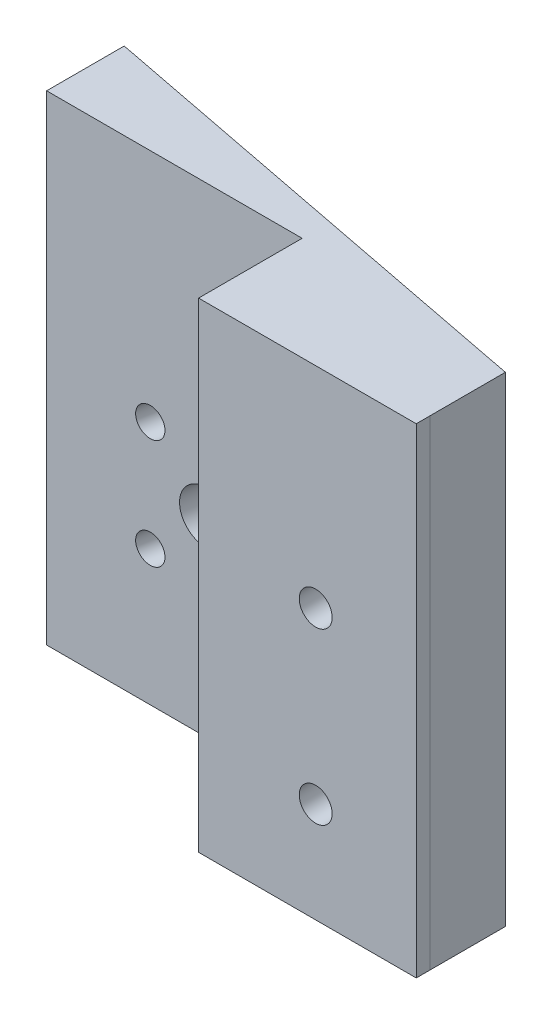
ISO-10303-21;
HEADER;
FILE_DESCRIPTION(('STEP AP214'),'2;1');
FILE_NAME('part.step','',(''),(''),'','','');
FILE_SCHEMA(('AUTOMOTIVE_DESIGN { 1 0 10303 214 1 1 1 1 }'));
ENDSEC;
DATA;
#1=APPLICATION_CONTEXT('core data for automotive mechanical design processes');
#2=APPLICATION_PROTOCOL_DEFINITION('international standard','automotive_design',2000,#1);
#3=PRODUCT_CONTEXT('',#1,'mechanical');
#4=PRODUCT('Part','Part','',(#3));
#5=PRODUCT_RELATED_PRODUCT_CATEGORY('part','',(#4));
#6=PRODUCT_DEFINITION_FORMATION('','',#4);
#7=PRODUCT_DEFINITION_CONTEXT('part definition',#1,'design');
#8=PRODUCT_DEFINITION('design','',#6,#7);
#9=PRODUCT_DEFINITION_SHAPE('','',#8);
#10=(LENGTH_UNIT() NAMED_UNIT(*) SI_UNIT(.MILLI.,.METRE.));
#11=(NAMED_UNIT(*) PLANE_ANGLE_UNIT() SI_UNIT($,.RADIAN.));
#12=(NAMED_UNIT(*) SI_UNIT($,.STERADIAN.) SOLID_ANGLE_UNIT());
#13=UNCERTAINTY_MEASURE_WITH_UNIT(LENGTH_MEASURE(1.E-05),#10,'distance_accuracy_value','');
#14=(GEOMETRIC_REPRESENTATION_CONTEXT(3) GLOBAL_UNCERTAINTY_ASSIGNED_CONTEXT((#13)) GLOBAL_UNIT_ASSIGNED_CONTEXT((#10,
#11,#12)) REPRESENTATION_CONTEXT('',''));
#15=CARTESIAN_POINT('',(0.,0.,0.));
#16=DIRECTION('',(0.,0.,1.));
#17=DIRECTION('',(1.,0.,0.));
#18=AXIS2_PLACEMENT_3D('',#15,#16,#17);
#19=CARTESIAN_POINT('',(3.44867350098541,70.,-17.7418871092655));
#20=DIRECTION('',(-0.190808995376538,0.,0.981627183447665));
#21=DIRECTION('',(0.981627183447665,0.,0.190808995376538));
#22=AXIS2_PLACEMENT_3D('',#19,#20,#21);
#23=PLANE('',#22);
#24=CARTESIAN_POINT('',(54.3368727091732,12.6086638620849,-7.85022321571653));
#25=DIRECTION('',(-0.190808995376538,0.,0.981627183447665));
#26=DIRECTION('',(0.981627183447665,0.,0.190808995376538));
#27=AXIS2_PLACEMENT_3D('',#24,#25,#26);
#28=ELLIPSE('',#27,2.44492006789251,2.4);
#29=CARTESIAN_POINT('',(56.7368727091732,12.6086638620849,-7.38371047378602));
#30=VERTEX_POINT('',#29);
#31=EDGE_CURVE('E416',#30,#30,#28,.T.);
#32=ORIENTED_EDGE('',*,*,#31,.T.);
#33=EDGE_LOOP('',(#32));
#34=FACE_BOUND('',#33,.T.);
#35=CARTESIAN_POINT('',(54.3368727091734,37.3862667273349,-7.8502232157165));
#36=DIRECTION('',(-0.190808995376538,0.,0.981627183447665));
#37=DIRECTION('',(0.981627183447665,0.,0.190808995376538));
#38=AXIS2_PLACEMENT_3D('',#35,#36,#37);
#39=ELLIPSE('',#38,2.44492006789251,2.4);
#40=CARTESIAN_POINT('',(56.7368727091734,37.3862667273349,-7.383710473786));
#41=VERTEX_POINT('',#40);
#42=EDGE_CURVE('E418',#41,#41,#39,.T.);
#43=ORIENTED_EDGE('',*,*,#42,.T.);
#44=EDGE_LOOP('',(#43));
#45=FACE_BOUND('',#44,.T.);
#46=CARTESIAN_POINT('',(16.6876621186104,33.72195575,-15.1684884091009));
#47=DIRECTION('',(0.190808995376538,0.,-0.981627183447665));
#48=DIRECTION('',(-0.981627183447665,0.,-0.190808995376538));
#49=AXIS2_PLACEMENT_3D('',#46,#47,#48);
#50=CIRCLE('',#49,2.1);
#51=CARTESIAN_POINT('',(14.6262450333704,33.72195575,-15.5691872993917));
#52=VERTEX_POINT('',#51);
#53=EDGE_CURVE('E417',#52,#52,#50,.T.);
#54=ORIENTED_EDGE('',*,*,#53,.F.);
#55=EDGE_LOOP('',(#54));
#56=FACE_BOUND('',#55,.T.);
#57=CARTESIAN_POINT('',(16.6876621186104,17.72195575,-15.1684884091009));
#58=DIRECTION('',(0.190808995376538,0.,-0.981627183447665));
#59=DIRECTION('',(-0.981627183447665,0.,-0.190808995376538));
#60=AXIS2_PLACEMENT_3D('',#57,#58,#59);
#61=CIRCLE('',#60,2.1);
#62=CARTESIAN_POINT('',(14.6262450333703,17.72195575,-15.5691872993917));
#63=VERTEX_POINT('',#62);
#64=EDGE_CURVE('E421',#63,#63,#61,.T.);
#65=ORIENTED_EDGE('',*,*,#64,.F.);
#66=EDGE_LOOP('',(#65));
#67=FACE_BOUND('',#66,.T.);
#68=CARTESIAN_POINT('',(32.3936970537731,17.72195575,-12.1155444830763));
#69=DIRECTION('',(0.190808995376538,0.,-0.981627183447665));
#70=DIRECTION('',(-0.981627183447665,0.,-0.190808995376538));
#71=AXIS2_PLACEMENT_3D('',#68,#69,#70);
#72=CIRCLE('',#71,2.1);
#73=CARTESIAN_POINT('',(30.332279968533,17.72195575,-12.516243373367));
#74=VERTEX_POINT('',#73);
#75=EDGE_CURVE('E427',#74,#74,#72,.T.);
#76=ORIENTED_EDGE('',*,*,#75,.F.);
#77=EDGE_LOOP('',(#76));
#78=FACE_BOUND('',#77,.T.);
#79=CARTESIAN_POINT('',(32.3936970537731,33.72195575,-12.1155444830763));
#80=DIRECTION('',(0.190808995376538,0.,-0.981627183447665));
#81=DIRECTION('',(-0.981627183447665,0.,-0.190808995376538));
#82=AXIS2_PLACEMENT_3D('',#79,#80,#81);
#83=CIRCLE('',#82,2.1);
#84=CARTESIAN_POINT('',(30.332279968533,33.72195575,-12.516243373367));
#85=VERTEX_POINT('',#84);
#86=EDGE_CURVE('E211',#85,#85,#83,.T.);
#87=ORIENTED_EDGE('',*,*,#86,.F.);
#88=EDGE_LOOP('',(#87));
#89=FACE_BOUND('',#88,.T.);
#90=CARTESIAN_POINT('',(24.5406795861918,25.72195575,-13.6420164460886));
#91=DIRECTION('',(0.190808995376538,0.,-0.981627183447665));
#92=DIRECTION('',(-0.981627183447665,0.,-0.190808995376538));
#93=AXIS2_PLACEMENT_3D('',#90,#91,#92);
#94=CIRCLE('',#93,3.81000000000006);
#95=CARTESIAN_POINT('',(20.8006800172561,25.72195575,-14.3689987184732));
#96=VERTEX_POINT('',#95);
#97=EDGE_CURVE('E139',#96,#96,#94,.T.);
#98=ORIENTED_EDGE('',*,*,#97,.F.);
#99=EDGE_LOOP('',(#98));
#100=FACE_BOUND('',#99,.T.);
#101=DIRECTION('',(-0.981627183447665,0.,-0.190808995376538));
#102=VECTOR('',#101,1.);
#103=CARTESIAN_POINT('',(3.44867350098541,68.,-17.7418871092655));
#104=LINE('',#103,#102);
#105=CARTESIAN_POINT('',(69.,68.,-5.));
#106=VERTEX_POINT('',#105);
#107=CARTESIAN_POINT('',(0.,68.,-18.4122413305021));
#108=VERTEX_POINT('',#107);
#109=EDGE_CURVE('E228',#106,#108,#104,.T.);
#110=ORIENTED_EDGE('',*,*,#109,.F.);
#111=DIRECTION('',(0.,-1.,0.));
#112=VECTOR('',#111,1.);
#113=CARTESIAN_POINT('',(69.,70.,-5.));
#114=LINE('',#113,#112);
#115=CARTESIAN_POINT('',(69.,-2.,-5.));
#116=VERTEX_POINT('',#115);
#117=EDGE_CURVE('E55',#106,#116,#114,.T.);
#118=ORIENTED_EDGE('',*,*,#117,.T.);
#119=DIRECTION('',(0.981627183447665,0.,0.190808995376538));
#120=VECTOR('',#119,1.);
#121=CARTESIAN_POINT('',(69.,-2.,-5.));
#122=LINE('',#121,#120);
#123=CARTESIAN_POINT('',(0.,-2.,-18.4122413305021));
#124=VERTEX_POINT('',#123);
#125=EDGE_CURVE('E195',#124,#116,#122,.T.);
#126=ORIENTED_EDGE('',*,*,#125,.F.);
#127=DIRECTION('',(0.,-1.,0.));
#128=VECTOR('',#127,1.);
#129=CARTESIAN_POINT('',(0.,70.,-18.4122413305021));
#130=LINE('',#129,#128);
#131=EDGE_CURVE('E13',#108,#124,#130,.T.);
#132=ORIENTED_EDGE('',*,*,#131,.F.);
#133=EDGE_LOOP('',(#110,#118,#126,#132));
#134=FACE_BOUND('',#133,.T.);
#135=ADVANCED_FACE('F47',(#34,#45,#56,#67,#78,#89,#100,#134),#23,.F.);
#136=CARTESIAN_POINT('',(0.,70.,0.));
#137=DIRECTION('',(1.,0.,0.));
#138=DIRECTION('',(0.,0.,-1.));
#139=AXIS2_PLACEMENT_3D('',#136,#137,#138);
#140=PLANE('',#139);
#141=DIRECTION('',(0.,0.,1.));
#142=VECTOR('',#141,1.);
#143=CARTESIAN_POINT('',(0.,68.,0.));
#144=LINE('',#143,#142);
#145=CARTESIAN_POINT('',(0.,68.,-7.1));
#146=VERTEX_POINT('',#145);
#147=EDGE_CURVE('E201',#108,#146,#144,.T.);
#148=ORIENTED_EDGE('',*,*,#147,.F.);
#149=ORIENTED_EDGE('',*,*,#131,.T.);
#150=DIRECTION('',(0.,0.,-1.));
#151=VECTOR('',#150,1.);
#152=CARTESIAN_POINT('',(0.,-2.,-18.4122413305021));
#153=LINE('',#152,#151);
#154=CARTESIAN_POINT('',(0.,-2.00000000000002,-7.1));
#155=VERTEX_POINT('',#154);
#156=EDGE_CURVE('E117',#155,#124,#153,.T.);
#157=ORIENTED_EDGE('',*,*,#156,.F.);
#158=DIRECTION('',(0.,1.,0.));
#159=VECTOR('',#158,1.);
#160=CARTESIAN_POINT('',(0.,-2.00000000000002,-7.1));
#161=LINE('',#160,#159);
#162=EDGE_CURVE('E240',#155,#146,#161,.T.);
#163=ORIENTED_EDGE('',*,*,#162,.T.);
#164=EDGE_LOOP('',(#148,#149,#157,#163));
#165=FACE_BOUND('',#164,.T.);
#166=ADVANCED_FACE('F182',(#165),#140,.F.);
#167=CARTESIAN_POINT('',(69.,70.,0.));
#168=DIRECTION('',(1.,0.,0.));
#169=DIRECTION('',(0.,0.,-1.));
#170=AXIS2_PLACEMENT_3D('',#167,#168,#169);
#171=PLANE('',#170);
#172=ORIENTED_EDGE('',*,*,#117,.F.);
#173=DIRECTION('',(0.,0.,1.));
#174=VECTOR('',#173,1.);
#175=CARTESIAN_POINT('',(69.,68.,0.));
#176=LINE('',#175,#174);
#177=CARTESIAN_POINT('',(69.0029404501429,68.,6.));
#178=VERTEX_POINT('',#177);
#179=EDGE_CURVE('E198',#106,#178,#176,.T.);
#180=ORIENTED_EDGE('',*,*,#179,.T.);
#181=CARTESIAN_POINT('',(69.0058809002858,-2.00000000000002,6.));
#182=DIRECTION('',(0.,1.,0.));
#183=VECTOR('',#182,1.);
#184=LINE('',#181,#183);
#185=CARTESIAN_POINT('',(69.0029404501429,-2.00000000000001,6.));
#186=VERTEX_POINT('',#185);
#187=EDGE_CURVE('E148',#186,#178,#184,.T.);
#188=ORIENTED_EDGE('',*,*,#187,.F.);
#189=DIRECTION('',(0.,0.,1.));
#190=VECTOR('',#189,1.);
#191=CARTESIAN_POINT('',(69.,-2.,6.));
#192=LINE('',#191,#190);
#193=EDGE_CURVE('E118',#116,#186,#192,.T.);
#194=ORIENTED_EDGE('',*,*,#193,.F.);
#195=EDGE_LOOP('',(#172,#180,#188,#194));
#196=FACE_BOUND('',#195,.T.);
#197=ADVANCED_FACE('F179',(#196),#171,.T.);
#198=CARTESIAN_POINT('',(37.2613586201258,0.,-9.1));
#199=DIRECTION('',(1.,0.,0.));
#200=DIRECTION('',(0.,0.,-1.));
#201=AXIS2_PLACEMENT_3D('',#198,#199,#200);
#202=PLANE('',#201);
#203=DIRECTION('',(0.,0.,1.));
#204=VECTOR('',#203,1.);
#205=CARTESIAN_POINT('',(37.2613586201258,68.,-9.1));
#206=LINE('',#205,#204);
#207=CARTESIAN_POINT('',(37.2613586201258,68.,-7.1));
#208=VERTEX_POINT('',#207);
#209=CARTESIAN_POINT('',(37.2613586201258,68.,8.));
#210=VERTEX_POINT('',#209);
#211=EDGE_CURVE('E202',#208,#210,#206,.T.);
#212=ORIENTED_EDGE('',*,*,#211,.F.);
#213=DIRECTION('',(0.,1.,0.));
#214=VECTOR('',#213,1.);
#215=CARTESIAN_POINT('',(37.2613586201258,-2.00000000000002,-7.1));
#216=LINE('',#215,#214);
#217=CARTESIAN_POINT('',(37.2613586201258,-2.00000000000002,-7.1));
#218=VERTEX_POINT('',#217);
#219=EDGE_CURVE('E113',#218,#208,#216,.T.);
#220=ORIENTED_EDGE('',*,*,#219,.F.);
#221=DIRECTION('',(0.,0.,-1.));
#222=VECTOR('',#221,1.);
#223=CARTESIAN_POINT('',(37.2613586201258,-2.,-9.1));
#224=LINE('',#223,#222);
#225=CARTESIAN_POINT('',(37.2613586201258,-2.00000000000002,8.));
#226=VERTEX_POINT('',#225);
#227=EDGE_CURVE('E107',#226,#218,#224,.T.);
#228=ORIENTED_EDGE('',*,*,#227,.F.);
#229=DIRECTION('',(0.,1.,0.));
#230=VECTOR('',#229,1.);
#231=CARTESIAN_POINT('',(37.2613586201258,-2.00000000000002,8.));
#232=LINE('',#231,#230);
#233=EDGE_CURVE('E111',#226,#210,#232,.T.);
#234=ORIENTED_EDGE('',*,*,#233,.T.);
#235=EDGE_LOOP('',(#212,#220,#228,#234));
#236=FACE_BOUND('',#235,.T.);
#237=ADVANCED_FACE('F110',(#236),#202,.F.);
#238=CARTESIAN_POINT('',(0.,-2.,0.));
#239=DIRECTION('',(0.,1.,0.));
#240=DIRECTION('',(0.,0.,1.));
#241=AXIS2_PLACEMENT_3D('',#238,#239,#240);
#242=PLANE('',#241);
#243=DIRECTION('',(1.,0.,0.));
#244=VECTOR('',#243,1.);
#245=CARTESIAN_POINT('',(0.,-2.00000000000002,-7.1));
#246=LINE('',#245,#244);
#247=EDGE_CURVE('E243',#155,#218,#246,.T.);
#248=ORIENTED_EDGE('',*,*,#247,.F.);
#249=ORIENTED_EDGE('',*,*,#156,.T.);
#250=ORIENTED_EDGE('',*,*,#125,.T.);
#251=ORIENTED_EDGE('',*,*,#193,.T.);
#252=DIRECTION('',(0.,0.,-1.));
#253=VECTOR('',#252,1.);
#254=CARTESIAN_POINT('',(69.0058809002858,-2.00000000000002,6.));
#255=LINE('',#254,#253);
#256=CARTESIAN_POINT('',(69.0058809002858,-2.00000000000002,8.));
#257=VERTEX_POINT('',#256);
#258=EDGE_CURVE('E127',#257,#186,#255,.T.);
#259=ORIENTED_EDGE('',*,*,#258,.F.);
#260=DIRECTION('',(1.,0.,0.));
#261=VECTOR('',#260,1.);
#262=CARTESIAN_POINT('',(37.2613586201258,-2.00000000000002,8.));
#263=LINE('',#262,#261);
#264=EDGE_CURVE('E123',#226,#257,#263,.T.);
#265=ORIENTED_EDGE('',*,*,#264,.F.);
#266=ORIENTED_EDGE('',*,*,#227,.T.);
#267=EDGE_LOOP('',(#248,#249,#250,#251,#259,#265,#266));
#268=FACE_BOUND('',#267,.T.);
#269=ADVANCED_FACE('F130',(#268),#242,.F.);
#270=CARTESIAN_POINT('',(28.7980207423715,68.,-8.89852110577039));
#271=DIRECTION('',(0.,1.,0.));
#272=DIRECTION('',(0.,0.,1.));
#273=AXIS2_PLACEMENT_3D('',#270,#271,#272);
#274=PLANE('',#273);
#275=ORIENTED_EDGE('',*,*,#109,.T.);
#276=ORIENTED_EDGE('',*,*,#147,.T.);
#277=DIRECTION('',(1.,0.,0.));
#278=VECTOR('',#277,1.);
#279=CARTESIAN_POINT('',(0.,68.,-7.1));
#280=LINE('',#279,#278);
#281=EDGE_CURVE('E63',#146,#208,#280,.T.);
#282=ORIENTED_EDGE('',*,*,#281,.T.);
#283=ORIENTED_EDGE('',*,*,#211,.T.);
#284=DIRECTION('',(1.,0.,0.));
#285=VECTOR('',#284,1.);
#286=CARTESIAN_POINT('',(37.2613586201258,68.,8.));
#287=LINE('',#286,#285);
#288=CARTESIAN_POINT('',(69.0058809002858,68.,8.));
#289=VERTEX_POINT('',#288);
#290=EDGE_CURVE('E125',#210,#289,#287,.T.);
#291=ORIENTED_EDGE('',*,*,#290,.T.);
#292=DIRECTION('',(0.,0.,-1.));
#293=VECTOR('',#292,1.);
#294=CARTESIAN_POINT('',(69.0058809002858,68.,6.));
#295=LINE('',#294,#293);
#296=EDGE_CURVE('E132',#289,#178,#295,.T.);
#297=ORIENTED_EDGE('',*,*,#296,.T.);
#298=ORIENTED_EDGE('',*,*,#179,.F.);
#299=EDGE_LOOP('',(#275,#276,#282,#283,#291,#297,#298));
#300=FACE_BOUND('',#299,.T.);
#301=ADVANCED_FACE('F171',(#300),#274,.T.);
#302=CARTESIAN_POINT('',(0.,-2.00000000000002,-7.1));
#303=DIRECTION('',(0.,0.,1.));
#304=DIRECTION('',(1.,0.,0.));
#305=AXIS2_PLACEMENT_3D('',#302,#303,#304);
#306=PLANE('',#305);
#307=CARTESIAN_POINT('',(15.1193068473754,33.72195575,-7.1));
#308=DIRECTION('',(0.,0.,1.));
#309=DIRECTION('',(1.,0.,0.));
#310=AXIS2_PLACEMENT_3D('',#307,#308,#309);
#311=ELLIPSE('',#310,2.13930505940594,2.1);
#312=CARTESIAN_POINT('',(17.2586119067813,33.72195575,-7.1));
#313=VERTEX_POINT('',#312);
#314=EDGE_CURVE('E50',#313,#313,#311,.T.);
#315=ORIENTED_EDGE('',*,*,#314,.F.);
#316=EDGE_LOOP('',(#315));
#317=FACE_BOUND('',#316,.T.);
#318=CARTESIAN_POINT('',(15.1193068473754,17.72195575,-7.1));
#319=DIRECTION('',(0.,0.,1.));
#320=DIRECTION('',(1.,0.,0.));
#321=AXIS2_PLACEMENT_3D('',#318,#319,#320);
#322=ELLIPSE('',#321,2.13930505940595,2.1);
#323=CARTESIAN_POINT('',(17.2586119067813,17.72195575,-7.1));
#324=VERTEX_POINT('',#323);
#325=EDGE_CURVE('E213',#324,#324,#322,.T.);
#326=ORIENTED_EDGE('',*,*,#325,.F.);
#327=EDGE_LOOP('',(#326));
#328=FACE_BOUND('',#327,.T.);
#329=CARTESIAN_POINT('',(31.4187739666588,17.72195575,-7.1));
#330=DIRECTION('',(0.,0.,1.));
#331=DIRECTION('',(1.,0.,0.));
#332=AXIS2_PLACEMENT_3D('',#329,#330,#331);
#333=ELLIPSE('',#332,2.13930505940595,2.1);
#334=CARTESIAN_POINT('',(33.5580790260647,17.72195575,-7.1));
#335=VERTEX_POINT('',#334);
#336=EDGE_CURVE('E210',#335,#335,#333,.T.);
#337=ORIENTED_EDGE('',*,*,#336,.F.);
#338=EDGE_LOOP('',(#337));
#339=FACE_BOUND('',#338,.T.);
#340=CARTESIAN_POINT('',(31.4187739666588,33.72195575,-7.1));
#341=DIRECTION('',(0.,0.,1.));
#342=DIRECTION('',(1.,0.,0.));
#343=AXIS2_PLACEMENT_3D('',#340,#341,#342);
#344=ELLIPSE('',#343,2.13930505940594,2.1);
#345=CARTESIAN_POINT('',(33.5580790260647,33.72195575,-7.1));
#346=VERTEX_POINT('',#345);
#347=EDGE_CURVE('E207',#346,#346,#344,.T.);
#348=ORIENTED_EDGE('',*,*,#347,.F.);
#349=EDGE_LOOP('',(#348));
#350=FACE_BOUND('',#349,.T.);
#351=CARTESIAN_POINT('',(23.2690404070171,25.72195575,-7.1));
#352=DIRECTION('',(0.,0.,1.));
#353=DIRECTION('',(1.,0.,0.));
#354=AXIS2_PLACEMENT_3D('',#351,#352,#353);
#355=ELLIPSE('',#354,3.88131060777943,3.81000000000006);
#356=CARTESIAN_POINT('',(27.1503510147965,25.72195575,-7.1));
#357=VERTEX_POINT('',#356);
#358=EDGE_CURVE('E142',#357,#357,#355,.T.);
#359=ORIENTED_EDGE('',*,*,#358,.F.);
#360=EDGE_LOOP('',(#359));
#361=FACE_BOUND('',#360,.T.);
#362=ORIENTED_EDGE('',*,*,#281,.F.);
#363=ORIENTED_EDGE('',*,*,#162,.F.);
#364=ORIENTED_EDGE('',*,*,#247,.T.);
#365=ORIENTED_EDGE('',*,*,#219,.T.);
#366=EDGE_LOOP('',(#362,#363,#364,#365));
#367=FACE_BOUND('',#366,.T.);
#368=ADVANCED_FACE('F163',(#317,#328,#339,#350,#361,#367),#306,.T.);
#369=CARTESIAN_POINT('',(69.0058809002858,-2.00000000000002,6.));
#370=DIRECTION('',(1.,0.,0.));
#371=DIRECTION('',(0.,0.,-1.));
#372=AXIS2_PLACEMENT_3D('',#369,#370,#371);
#373=PLANE('',#372);
#374=ORIENTED_EDGE('',*,*,#296,.F.);
#375=DIRECTION('',(0.,1.,0.));
#376=VECTOR('',#375,1.);
#377=CARTESIAN_POINT('',(69.0058809002858,-2.00000000000002,8.));
#378=LINE('',#377,#376);
#379=EDGE_CURVE('E126',#257,#289,#378,.T.);
#380=ORIENTED_EDGE('',*,*,#379,.F.);
#381=ORIENTED_EDGE('',*,*,#258,.T.);
#382=ORIENTED_EDGE('',*,*,#187,.T.);
#383=EDGE_LOOP('',(#374,#380,#381,#382));
#384=FACE_BOUND('',#383,.T.);
#385=ADVANCED_FACE('F153',(#384),#373,.T.);
#386=CARTESIAN_POINT('',(37.2613586201258,-2.00000000000002,8.));
#387=DIRECTION('',(0.,0.,1.));
#388=DIRECTION('',(1.,0.,0.));
#389=AXIS2_PLACEMENT_3D('',#386,#387,#388);
#390=PLANE('',#389);
#391=CARTESIAN_POINT('',(54.3368727091732,12.6086638620849,8.));
#392=DIRECTION('',(0.,0.,1.));
#393=DIRECTION('',(1.,0.,0.));
#394=AXIS2_PLACEMENT_3D('',#391,#392,#393);
#395=CIRCLE('',#394,2.4);
#396=CARTESIAN_POINT('',(56.7368727091732,12.6086638620849,8.));
#397=VERTEX_POINT('',#396);
#398=EDGE_CURVE('E413',#397,#397,#395,.T.);
#399=ORIENTED_EDGE('',*,*,#398,.F.);
#400=EDGE_LOOP('',(#399));
#401=FACE_BOUND('',#400,.T.);
#402=CARTESIAN_POINT('',(54.3368727091734,37.3862667273349,8.));
#403=DIRECTION('',(0.,0.,1.));
#404=DIRECTION('',(1.,0.,0.));
#405=AXIS2_PLACEMENT_3D('',#402,#403,#404);
#406=CIRCLE('',#405,2.4);
#407=CARTESIAN_POINT('',(56.7368727091734,37.3862667273349,8.));
#408=VERTEX_POINT('',#407);
#409=EDGE_CURVE('E441',#408,#408,#406,.T.);
#410=ORIENTED_EDGE('',*,*,#409,.F.);
#411=EDGE_LOOP('',(#410));
#412=FACE_BOUND('',#411,.T.);
#413=ORIENTED_EDGE('',*,*,#290,.F.);
#414=ORIENTED_EDGE('',*,*,#233,.F.);
#415=ORIENTED_EDGE('',*,*,#264,.T.);
#416=ORIENTED_EDGE('',*,*,#379,.T.);
#417=EDGE_LOOP('',(#413,#414,#415,#416));
#418=FACE_BOUND('',#417,.T.);
#419=ADVANCED_FACE('F122',(#401,#412,#418),#390,.T.);
#420=CARTESIAN_POINT('',(19.5903394534409,25.72195575,11.8252757642747));
#421=DIRECTION('',(0.190808995376538,0.,-0.981627183447665));
#422=DIRECTION('',(-0.981627183447665,0.,-0.190808995376538));
#423=AXIS2_PLACEMENT_3D('',#420,#421,#422);
#424=CYLINDRICAL_SURFACE('',#423,3.81000000000006);
#425=ORIENTED_EDGE('',*,*,#358,.T.);
#426=EDGE_LOOP('',(#425));
#427=FACE_BOUND('',#426,.T.);
#428=ORIENTED_EDGE('',*,*,#97,.T.);
#429=EDGE_LOOP('',(#428));
#430=FACE_BOUND('',#429,.T.);
#431=ADVANCED_FACE('F164',(#427,#430),#424,.F.);
#432=CARTESIAN_POINT('',(30.4856071000077,33.72195575,-2.29927264859966));
#433=DIRECTION('',(0.190808995376538,0.,-0.981627183447665));
#434=DIRECTION('',(-0.981627183447665,0.,-0.190808995376538));
#435=AXIS2_PLACEMENT_3D('',#432,#433,#434);
#436=CYLINDRICAL_SURFACE('',#435,2.1);
#437=ORIENTED_EDGE('',*,*,#347,.T.);
#438=EDGE_LOOP('',(#437));
#439=FACE_BOUND('',#438,.T.);
#440=ORIENTED_EDGE('',*,*,#86,.T.);
#441=EDGE_LOOP('',(#440));
#442=FACE_BOUND('',#441,.T.);
#443=ADVANCED_FACE('F292',(#439,#442),#436,.F.);
#444=CARTESIAN_POINT('',(30.4856071000077,17.72195575,-2.29927264859966));
#445=DIRECTION('',(0.190808995376538,0.,-0.981627183447665));
#446=DIRECTION('',(-0.981627183447665,0.,-0.190808995376538));
#447=AXIS2_PLACEMENT_3D('',#444,#445,#446);
#448=CYLINDRICAL_SURFACE('',#447,2.1);
#449=ORIENTED_EDGE('',*,*,#336,.T.);
#450=EDGE_LOOP('',(#449));
#451=FACE_BOUND('',#450,.T.);
#452=ORIENTED_EDGE('',*,*,#75,.T.);
#453=EDGE_LOOP('',(#452));
#454=FACE_BOUND('',#453,.T.);
#455=ADVANCED_FACE('F298',(#451,#454),#448,.F.);
#456=CARTESIAN_POINT('',(14.7795721648451,17.72195575,-5.35221657462428));
#457=DIRECTION('',(0.190808995376538,0.,-0.981627183447665));
#458=DIRECTION('',(-0.981627183447665,0.,-0.190808995376538));
#459=AXIS2_PLACEMENT_3D('',#456,#457,#458);
#460=CYLINDRICAL_SURFACE('',#459,2.1);
#461=ORIENTED_EDGE('',*,*,#325,.T.);
#462=EDGE_LOOP('',(#461));
#463=FACE_BOUND('',#462,.T.);
#464=ORIENTED_EDGE('',*,*,#64,.T.);
#465=EDGE_LOOP('',(#464));
#466=FACE_BOUND('',#465,.T.);
#467=ADVANCED_FACE('F305',(#463,#466),#460,.F.);
#468=CARTESIAN_POINT('',(14.7795721648451,33.72195575,-5.35221657462428));
#469=DIRECTION('',(0.190808995376538,0.,-0.981627183447665));
#470=DIRECTION('',(-0.981627183447665,0.,-0.190808995376538));
#471=AXIS2_PLACEMENT_3D('',#468,#469,#470);
#472=CYLINDRICAL_SURFACE('',#471,2.1);
#473=ORIENTED_EDGE('',*,*,#314,.T.);
#474=EDGE_LOOP('',(#473));
#475=FACE_BOUND('',#474,.T.);
#476=ORIENTED_EDGE('',*,*,#53,.T.);
#477=EDGE_LOOP('',(#476));
#478=FACE_BOUND('',#477,.T.);
#479=ADVANCED_FACE('F313',(#475,#478),#472,.F.);
#480=CARTESIAN_POINT('',(54.3368727091734,37.3862667273349,-32.));
#481=DIRECTION('',(0.,0.,1.));
#482=DIRECTION('',(1.,0.,0.));
#483=AXIS2_PLACEMENT_3D('',#480,#481,#482);
#484=CYLINDRICAL_SURFACE('',#483,2.4);
#485=ORIENTED_EDGE('',*,*,#409,.T.);
#486=EDGE_LOOP('',(#485));
#487=FACE_BOUND('',#486,.T.);
#488=ORIENTED_EDGE('',*,*,#42,.F.);
#489=EDGE_LOOP('',(#488));
#490=FACE_BOUND('',#489,.T.);
#491=ADVANCED_FACE('F320',(#487,#490),#484,.F.);
#492=CARTESIAN_POINT('',(54.3368727091732,12.6086638620849,-32.));
#493=DIRECTION('',(0.,0.,1.));
#494=DIRECTION('',(1.,0.,0.));
#495=AXIS2_PLACEMENT_3D('',#492,#493,#494);
#496=CYLINDRICAL_SURFACE('',#495,2.4);
#497=ORIENTED_EDGE('',*,*,#398,.T.);
#498=EDGE_LOOP('',(#497));
#499=FACE_BOUND('',#498,.T.);
#500=ORIENTED_EDGE('',*,*,#31,.F.);
#501=EDGE_LOOP('',(#500));
#502=FACE_BOUND('',#501,.T.);
#503=ADVANCED_FACE('F326',(#499,#502),#496,.F.);
#504=CLOSED_SHELL('',(#135,#166,#197,#237,#269,#301,#368,#385,#419,#431,#443,#455,#467,#479,
#491,#503));
#505=MANIFOLD_SOLID_BREP('B2',#504);
#506=ADVANCED_BREP_SHAPE_REPRESENTATION('',(#18,#505),#14);
#507=SHAPE_DEFINITION_REPRESENTATION(#9,#506);
ENDSEC;
END-ISO-10303-21;
